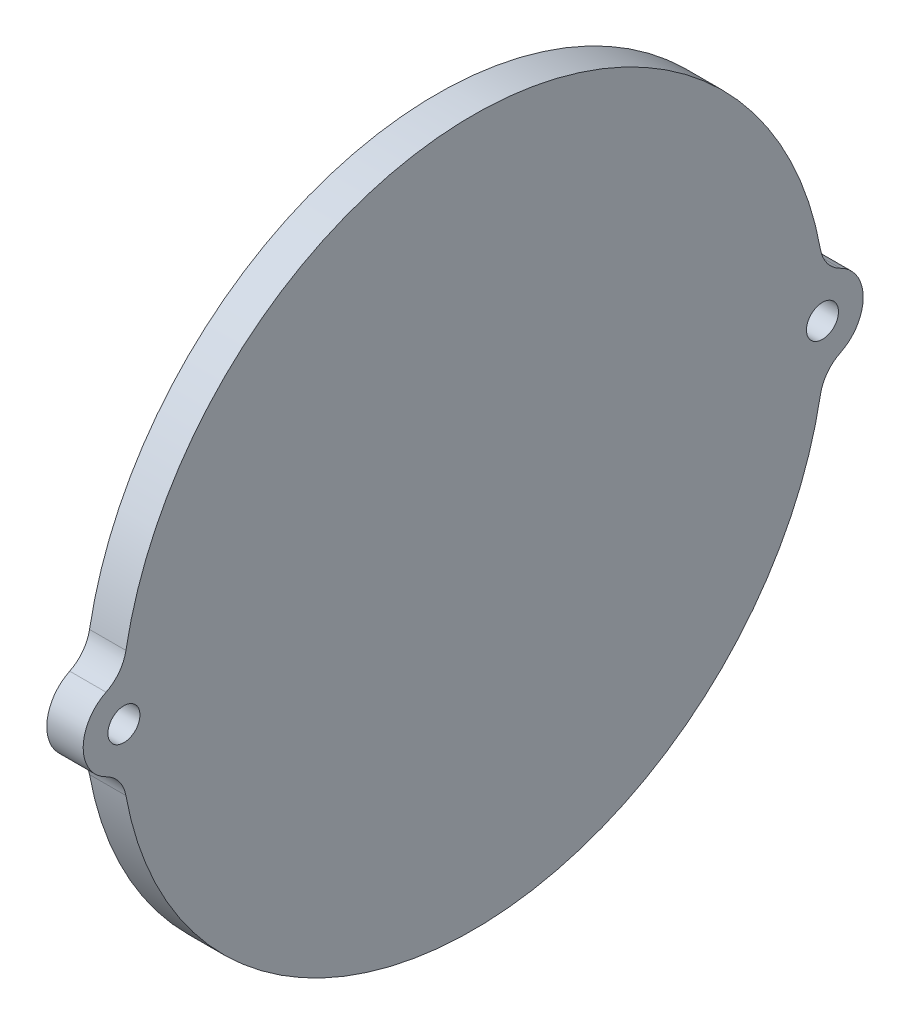
ISO-10303-21;
HEADER;
FILE_DESCRIPTION(('STEP AP214'),'2;1');
FILE_NAME('part.step','',(''),(''),'','','');
FILE_SCHEMA(('AUTOMOTIVE_DESIGN { 1 0 10303 214 1 1 1 1 }'));
ENDSEC;
DATA;
#1=APPLICATION_CONTEXT('core data for automotive mechanical design processes');
#2=APPLICATION_PROTOCOL_DEFINITION('international standard','automotive_design',2000,#1);
#3=PRODUCT_CONTEXT('',#1,'mechanical');
#4=PRODUCT('Part','Part','',(#3));
#5=PRODUCT_RELATED_PRODUCT_CATEGORY('part','',(#4));
#6=PRODUCT_DEFINITION_FORMATION('','',#4);
#7=PRODUCT_DEFINITION_CONTEXT('part definition',#1,'design');
#8=PRODUCT_DEFINITION('design','',#6,#7);
#9=PRODUCT_DEFINITION_SHAPE('','',#8);
#10=(LENGTH_UNIT() NAMED_UNIT(*) SI_UNIT(.MILLI.,.METRE.));
#11=(NAMED_UNIT(*) PLANE_ANGLE_UNIT() SI_UNIT($,.RADIAN.));
#12=(NAMED_UNIT(*) SI_UNIT($,.STERADIAN.) SOLID_ANGLE_UNIT());
#13=UNCERTAINTY_MEASURE_WITH_UNIT(LENGTH_MEASURE(1.E-05),#10,'distance_accuracy_value','');
#14=(GEOMETRIC_REPRESENTATION_CONTEXT(3) GLOBAL_UNCERTAINTY_ASSIGNED_CONTEXT((#13)) GLOBAL_UNIT_ASSIGNED_CONTEXT((#10,
#11,#12)) REPRESENTATION_CONTEXT('',''));
#15=CARTESIAN_POINT('',(0.,0.,0.));
#16=DIRECTION('',(0.,0.,1.));
#17=DIRECTION('',(1.,0.,0.));
#18=AXIS2_PLACEMENT_3D('',#15,#16,#17);
#19=CARTESIAN_POINT('',(0.,0.,0.));
#20=DIRECTION('',(1.,0.,0.));
#21=DIRECTION('',(0.,0.,-1.));
#22=AXIS2_PLACEMENT_3D('',#19,#20,#21);
#23=CYLINDRICAL_SURFACE('',#22,24.25);
#24=CARTESIAN_POINT('',(0.,0.,0.));
#25=DIRECTION('',(1.,0.,0.));
#26=DIRECTION('',(0.,0.,-1.));
#27=AXIS2_PLACEMENT_3D('',#24,#25,#26);
#28=CIRCLE('',#27,24.25);
#29=CARTESIAN_POINT('',(0.,4.3188637356535,-23.8623116238318));
#30=VERTEX_POINT('',#29);
#31=CARTESIAN_POINT('',(0.,4.3188637356535,23.8623116238318));
#32=VERTEX_POINT('',#31);
#33=EDGE_CURVE('E154',#30,#32,#28,.T.);
#34=ORIENTED_EDGE('',*,*,#33,.F.);
#35=DIRECTION('',(1.,0.,0.));
#36=VECTOR('',#35,1.);
#37=CARTESIAN_POINT('',(0.,4.3188637356535,-23.8623116238318));
#38=LINE('',#37,#36);
#39=CARTESIAN_POINT('',(-2.5,4.3188637356535,-23.8623116238318));
#40=VERTEX_POINT('',#39);
#41=EDGE_CURVE('E160',#30,#40,#38,.F.);
#42=ORIENTED_EDGE('',*,*,#41,.T.);
#43=CARTESIAN_POINT('',(-2.5,0.,0.));
#44=DIRECTION('',(1.,0.,0.));
#45=DIRECTION('',(0.,0.,-1.));
#46=AXIS2_PLACEMENT_3D('',#43,#44,#45);
#47=CIRCLE('',#46,24.25);
#48=CARTESIAN_POINT('',(-2.5,4.3188637356535,23.8623116238318));
#49=VERTEX_POINT('',#48);
#50=EDGE_CURVE('E149',#40,#49,#47,.T.);
#51=ORIENTED_EDGE('',*,*,#50,.T.);
#52=DIRECTION('',(1.,0.,0.));
#53=VECTOR('',#52,1.);
#54=CARTESIAN_POINT('',(0.,4.3188637356535,23.8623116238318));
#55=LINE('',#54,#53);
#56=EDGE_CURVE('E158',#49,#32,#55,.T.);
#57=ORIENTED_EDGE('',*,*,#56,.T.);
#58=EDGE_LOOP('',(#34,#42,#51,#57));
#59=FACE_BOUND('',#58,.T.);
#60=ADVANCED_FACE('F34',(#59),#23,.T.);
#61=CARTESIAN_POINT('',(-2.5,0.,0.));
#62=DIRECTION('',(-1.,0.,0.));
#63=DIRECTION('',(0.,0.,1.));
#64=AXIS2_PLACEMENT_3D('',#61,#62,#63);
#65=PLANE('',#64);
#66=CARTESIAN_POINT('',(-2.5,0.,24.));
#67=DIRECTION('',(-1.,0.,0.));
#68=DIRECTION('',(0.,0.,1.));
#69=AXIS2_PLACEMENT_3D('',#66,#67,#68);
#70=CIRCLE('',#69,1.1);
#71=CARTESIAN_POINT('',(-2.5,0.,25.1));
#72=VERTEX_POINT('',#71);
#73=EDGE_CURVE('E142',#72,#72,#70,.F.);
#74=ORIENTED_EDGE('',*,*,#73,.T.);
#75=EDGE_LOOP('',(#74));
#76=FACE_BOUND('',#75,.T.);
#77=CARTESIAN_POINT('',(-2.5,0.,-24.));
#78=DIRECTION('',(-1.,0.,0.));
#79=DIRECTION('',(0.,0.,1.));
#80=AXIS2_PLACEMENT_3D('',#77,#78,#79);
#81=CIRCLE('',#80,1.1);
#82=CARTESIAN_POINT('',(-2.5,0.,-22.9));
#83=VERTEX_POINT('',#82);
#84=EDGE_CURVE('E139',#83,#83,#81,.F.);
#85=ORIENTED_EDGE('',*,*,#84,.T.);
#86=EDGE_LOOP('',(#85));
#87=FACE_BOUND('',#86,.T.);
#88=CARTESIAN_POINT('',(-2.5,0.,0.));
#89=DIRECTION('',(-1.,0.,0.));
#90=DIRECTION('',(0.,0.,1.));
#91=AXIS2_PLACEMENT_3D('',#88,#89,#90);
#92=CIRCLE('',#91,17.25);
#93=CARTESIAN_POINT('',(-2.5,0.,17.25));
#94=VERTEX_POINT('',#93);
#95=EDGE_CURVE('E135',#94,#94,#92,.T.);
#96=ORIENTED_EDGE('',*,*,#95,.F.);
#97=EDGE_LOOP('',(#96));
#98=FACE_BOUND('',#97,.T.);
#99=ORIENTED_EDGE('',*,*,#50,.F.);
#100=CARTESIAN_POINT('',(-2.5,4.76410741974149,-26.32234375));
#101=DIRECTION('',(-1.,0.,0.));
#102=DIRECTION('',(0.,0.,1.));
#103=AXIS2_PLACEMENT_3D('',#100,#101,#102);
#104=CIRCLE('',#103,2.5);
#105=CARTESIAN_POINT('',(-2.5,2.51688693873135,-25.2268985849057));
#106=VERTEX_POINT('',#105);
#107=EDGE_CURVE('E112',#40,#106,#104,.F.);
#108=ORIENTED_EDGE('',*,*,#107,.T.);
#109=CARTESIAN_POINT('',(-2.5,0.,-24.));
#110=DIRECTION('',(-1.,0.,0.));
#111=DIRECTION('',(0.,0.,1.));
#112=AXIS2_PLACEMENT_3D('',#109,#110,#111);
#113=CIRCLE('',#112,2.8);
#114=CARTESIAN_POINT('',(-2.5,-2.51688693873135,-25.2268985849057));
#115=VERTEX_POINT('',#114);
#116=EDGE_CURVE('E119',#115,#106,#113,.F.);
#117=ORIENTED_EDGE('',*,*,#116,.F.);
#118=CARTESIAN_POINT('',(-2.5,-4.76410741974149,-26.32234375));
#119=DIRECTION('',(-1.,0.,0.));
#120=DIRECTION('',(0.,0.,1.));
#121=AXIS2_PLACEMENT_3D('',#118,#119,#120);
#122=CIRCLE('',#121,2.5);
#123=CARTESIAN_POINT('',(-2.5,-4.3188637356535,-23.8623116238318));
#124=VERTEX_POINT('',#123);
#125=EDGE_CURVE('E101',#115,#124,#122,.F.);
#126=ORIENTED_EDGE('',*,*,#125,.T.);
#127=CARTESIAN_POINT('',(-2.5,-4.3188637356535,23.8623116238318));
#128=VERTEX_POINT('',#127);
#129=EDGE_CURVE('E152',#128,#124,#47,.T.);
#130=ORIENTED_EDGE('',*,*,#129,.F.);
#131=CARTESIAN_POINT('',(-2.5,-4.76410741974149,26.32234375));
#132=DIRECTION('',(-1.,0.,0.));
#133=DIRECTION('',(0.,0.,1.));
#134=AXIS2_PLACEMENT_3D('',#131,#132,#133);
#135=CIRCLE('',#134,2.5);
#136=CARTESIAN_POINT('',(-2.5,-2.51688693873135,25.2268985849057));
#137=VERTEX_POINT('',#136);
#138=EDGE_CURVE('E175',#128,#137,#135,.F.);
#139=ORIENTED_EDGE('',*,*,#138,.T.);
#140=CARTESIAN_POINT('',(-2.5,0.,24.));
#141=DIRECTION('',(-1.,0.,0.));
#142=DIRECTION('',(0.,0.,1.));
#143=AXIS2_PLACEMENT_3D('',#140,#141,#142);
#144=CIRCLE('',#143,2.8);
#145=CARTESIAN_POINT('',(-2.5,2.51688693873135,25.2268985849057));
#146=VERTEX_POINT('',#145);
#147=EDGE_CURVE('E146',#146,#137,#144,.F.);
#148=ORIENTED_EDGE('',*,*,#147,.F.);
#149=CARTESIAN_POINT('',(-2.5,4.76410741974149,26.32234375));
#150=DIRECTION('',(-1.,0.,0.));
#151=DIRECTION('',(0.,0.,1.));
#152=AXIS2_PLACEMENT_3D('',#149,#150,#151);
#153=CIRCLE('',#152,2.5);
#154=EDGE_CURVE('E177',#146,#49,#153,.F.);
#155=ORIENTED_EDGE('',*,*,#154,.T.);
#156=EDGE_LOOP('',(#99,#108,#117,#126,#130,#139,#148,#155));
#157=FACE_BOUND('',#156,.T.);
#158=ADVANCED_FACE('F127',(#76,#87,#98,#157),#65,.T.);
#159=CARTESIAN_POINT('',(0.,0.,0.));
#160=DIRECTION('',(1.,0.,0.));
#161=DIRECTION('',(0.,0.,-1.));
#162=AXIS2_PLACEMENT_3D('',#159,#160,#161);
#163=PLANE('',#162);
#164=CARTESIAN_POINT('',(0.,0.,24.));
#165=DIRECTION('',(1.,0.,0.));
#166=DIRECTION('',(0.,0.,-1.));
#167=AXIS2_PLACEMENT_3D('',#164,#165,#166);
#168=CIRCLE('',#167,1.1);
#169=CARTESIAN_POINT('',(0.,0.,22.9));
#170=VERTEX_POINT('',#169);
#171=EDGE_CURVE('E143',#170,#170,#168,.T.);
#172=ORIENTED_EDGE('',*,*,#171,.F.);
#173=EDGE_LOOP('',(#172));
#174=FACE_BOUND('',#173,.T.);
#175=CARTESIAN_POINT('',(0.,0.,-24.));
#176=DIRECTION('',(1.,0.,0.));
#177=DIRECTION('',(0.,0.,1.));
#178=AXIS2_PLACEMENT_3D('',#175,#176,#177);
#179=CIRCLE('',#178,1.1);
#180=CARTESIAN_POINT('',(0.,0.,-22.9));
#181=VERTEX_POINT('',#180);
#182=EDGE_CURVE('E129',#181,#181,#179,.T.);
#183=ORIENTED_EDGE('',*,*,#182,.F.);
#184=EDGE_LOOP('',(#183));
#185=FACE_BOUND('',#184,.T.);
#186=CARTESIAN_POINT('',(0.,0.,24.));
#187=DIRECTION('',(1.,0.,0.));
#188=DIRECTION('',(0.,0.,-1.));
#189=AXIS2_PLACEMENT_3D('',#186,#187,#188);
#190=CIRCLE('',#189,2.8);
#191=CARTESIAN_POINT('',(0.,2.51688693873135,25.2268985849057));
#192=VERTEX_POINT('',#191);
#193=CARTESIAN_POINT('',(0.,-2.51688693873135,25.2268985849057));
#194=VERTEX_POINT('',#193);
#195=EDGE_CURVE('E140',#192,#194,#190,.T.);
#196=ORIENTED_EDGE('',*,*,#195,.T.);
#197=CARTESIAN_POINT('',(0.,-4.76410741974149,26.32234375));
#198=DIRECTION('',(1.,0.,0.));
#199=DIRECTION('',(0.,0.,-1.));
#200=AXIS2_PLACEMENT_3D('',#197,#198,#199);
#201=CIRCLE('',#200,2.5);
#202=CARTESIAN_POINT('',(0.,-4.3188637356535,23.8623116238318));
#203=VERTEX_POINT('',#202);
#204=EDGE_CURVE('E49',#194,#203,#201,.F.);
#205=ORIENTED_EDGE('',*,*,#204,.T.);
#206=CARTESIAN_POINT('',(0.,-4.3188637356535,-23.8623116238318));
#207=VERTEX_POINT('',#206);
#208=EDGE_CURVE('E124',#203,#207,#28,.T.);
#209=ORIENTED_EDGE('',*,*,#208,.T.);
#210=CARTESIAN_POINT('',(0.,-4.76410741974149,-26.32234375));
#211=DIRECTION('',(1.,0.,0.));
#212=DIRECTION('',(0.,0.,-1.));
#213=AXIS2_PLACEMENT_3D('',#210,#211,#212);
#214=CIRCLE('',#213,2.5);
#215=CARTESIAN_POINT('',(0.,-2.51688693873135,-25.2268985849057));
#216=VERTEX_POINT('',#215);
#217=EDGE_CURVE('E111',#207,#216,#214,.F.);
#218=ORIENTED_EDGE('',*,*,#217,.T.);
#219=CARTESIAN_POINT('',(0.,0.,-24.));
#220=DIRECTION('',(1.,0.,0.));
#221=DIRECTION('',(0.,0.,-1.));
#222=AXIS2_PLACEMENT_3D('',#219,#220,#221);
#223=CIRCLE('',#222,2.8);
#224=CARTESIAN_POINT('',(0.,2.51688693873135,-25.2268985849057));
#225=VERTEX_POINT('',#224);
#226=EDGE_CURVE('E122',#216,#225,#223,.T.);
#227=ORIENTED_EDGE('',*,*,#226,.T.);
#228=CARTESIAN_POINT('',(0.,4.76410741974149,-26.32234375));
#229=DIRECTION('',(1.,0.,0.));
#230=DIRECTION('',(0.,0.,-1.));
#231=AXIS2_PLACEMENT_3D('',#228,#229,#230);
#232=CIRCLE('',#231,2.5);
#233=EDGE_CURVE('E170',#225,#30,#232,.F.);
#234=ORIENTED_EDGE('',*,*,#233,.T.);
#235=ORIENTED_EDGE('',*,*,#33,.T.);
#236=CARTESIAN_POINT('',(0.,4.76410741974149,26.32234375));
#237=DIRECTION('',(1.,0.,0.));
#238=DIRECTION('',(0.,0.,-1.));
#239=AXIS2_PLACEMENT_3D('',#236,#237,#238);
#240=CIRCLE('',#239,2.5);
#241=EDGE_CURVE('E42',#32,#192,#240,.F.);
#242=ORIENTED_EDGE('',*,*,#241,.T.);
#243=EDGE_LOOP('',(#196,#205,#209,#218,#227,#234,#235,#242));
#244=FACE_BOUND('',#243,.T.);
#245=ADVANCED_FACE('F188',(#174,#185,#244),#163,.T.);
#246=ORIENTED_EDGE('',*,*,#129,.T.);
#247=DIRECTION('',(1.,0.,0.));
#248=VECTOR('',#247,1.);
#249=CARTESIAN_POINT('',(0.,-4.3188637356535,-23.8623116238318));
#250=LINE('',#249,#248);
#251=EDGE_CURVE('E106',#124,#207,#250,.T.);
#252=ORIENTED_EDGE('',*,*,#251,.T.);
#253=ORIENTED_EDGE('',*,*,#208,.F.);
#254=DIRECTION('',(1.,0.,0.));
#255=VECTOR('',#254,1.);
#256=CARTESIAN_POINT('',(0.,-4.3188637356535,23.8623116238318));
#257=LINE('',#256,#255);
#258=EDGE_CURVE('E162',#203,#128,#257,.F.);
#259=ORIENTED_EDGE('',*,*,#258,.T.);
#260=EDGE_LOOP('',(#246,#252,#253,#259));
#261=FACE_BOUND('',#260,.T.);
#262=ADVANCED_FACE('F191',(#261),#23,.T.);
#263=CARTESIAN_POINT('',(-10.4195959492893,0.,24.));
#264=DIRECTION('',(1.,0.,0.));
#265=DIRECTION('',(0.,0.,-1.));
#266=AXIS2_PLACEMENT_3D('',#263,#264,#265);
#267=CYLINDRICAL_SURFACE('',#266,2.8);
#268=ORIENTED_EDGE('',*,*,#147,.T.);
#269=DIRECTION('',(1.,0.,0.));
#270=VECTOR('',#269,1.);
#271=CARTESIAN_POINT('',(-10.4195959492893,-2.51688693873135,25.2268985849057));
#272=LINE('',#271,#270);
#273=EDGE_CURVE('E168',#137,#194,#272,.T.);
#274=ORIENTED_EDGE('',*,*,#273,.T.);
#275=ORIENTED_EDGE('',*,*,#195,.F.);
#276=DIRECTION('',(1.,0.,0.));
#277=VECTOR('',#276,1.);
#278=CARTESIAN_POINT('',(-10.4195959492893,2.51688693873135,25.2268985849057));
#279=LINE('',#278,#277);
#280=EDGE_CURVE('E165',#192,#146,#279,.F.);
#281=ORIENTED_EDGE('',*,*,#280,.T.);
#282=EDGE_LOOP('',(#268,#274,#275,#281));
#283=FACE_BOUND('',#282,.T.);
#284=ADVANCED_FACE('F187',(#283),#267,.T.);
#285=CARTESIAN_POINT('',(-10.4195959492893,0.,24.));
#286=DIRECTION('',(1.,0.,0.));
#287=DIRECTION('',(0.,0.,-1.));
#288=AXIS2_PLACEMENT_3D('',#285,#286,#287);
#289=CYLINDRICAL_SURFACE('',#288,1.1);
#290=ORIENTED_EDGE('',*,*,#171,.T.);
#291=EDGE_LOOP('',(#290));
#292=FACE_BOUND('',#291,.T.);
#293=ORIENTED_EDGE('',*,*,#73,.F.);
#294=EDGE_LOOP('',(#293));
#295=FACE_BOUND('',#294,.T.);
#296=ADVANCED_FACE('F217',(#292,#295),#289,.F.);
#297=CARTESIAN_POINT('',(-10.4195959492893,0.,-24.));
#298=DIRECTION('',(1.,0.,0.));
#299=DIRECTION('',(0.,0.,-1.));
#300=AXIS2_PLACEMENT_3D('',#297,#298,#299);
#301=CYLINDRICAL_SURFACE('',#300,2.8);
#302=ORIENTED_EDGE('',*,*,#116,.T.);
#303=DIRECTION('',(1.,0.,0.));
#304=VECTOR('',#303,1.);
#305=CARTESIAN_POINT('',(-10.4195959492893,2.51688693873135,-25.2268985849057));
#306=LINE('',#305,#304);
#307=EDGE_CURVE('E123',#106,#225,#306,.T.);
#308=ORIENTED_EDGE('',*,*,#307,.T.);
#309=ORIENTED_EDGE('',*,*,#226,.F.);
#310=DIRECTION('',(1.,0.,0.));
#311=VECTOR('',#310,1.);
#312=CARTESIAN_POINT('',(-10.4195959492893,-2.51688693873135,-25.2268985849057));
#313=LINE('',#312,#311);
#314=EDGE_CURVE('E105',#216,#115,#313,.F.);
#315=ORIENTED_EDGE('',*,*,#314,.T.);
#316=EDGE_LOOP('',(#302,#308,#309,#315));
#317=FACE_BOUND('',#316,.T.);
#318=ADVANCED_FACE('F117',(#317),#301,.T.);
#319=CARTESIAN_POINT('',(-10.4195959492893,0.,-24.));
#320=DIRECTION('',(1.,0.,0.));
#321=DIRECTION('',(0.,0.,-1.));
#322=AXIS2_PLACEMENT_3D('',#319,#320,#321);
#323=CYLINDRICAL_SURFACE('',#322,1.1);
#324=ORIENTED_EDGE('',*,*,#182,.T.);
#325=EDGE_LOOP('',(#324));
#326=FACE_BOUND('',#325,.T.);
#327=ORIENTED_EDGE('',*,*,#84,.F.);
#328=EDGE_LOOP('',(#327));
#329=FACE_BOUND('',#328,.T.);
#330=ADVANCED_FACE('F226',(#326,#329),#323,.F.);
#331=CARTESIAN_POINT('',(0.,4.76410741974149,-26.32234375));
#332=DIRECTION('',(-1.,0.,0.));
#333=DIRECTION('',(0.,0.,1.));
#334=AXIS2_PLACEMENT_3D('',#331,#332,#333);
#335=CYLINDRICAL_SURFACE('',#334,2.5);
#336=ORIENTED_EDGE('',*,*,#107,.F.);
#337=ORIENTED_EDGE('',*,*,#41,.F.);
#338=ORIENTED_EDGE('',*,*,#233,.F.);
#339=ORIENTED_EDGE('',*,*,#307,.F.);
#340=EDGE_LOOP('',(#336,#337,#338,#339));
#341=FACE_BOUND('',#340,.T.);
#342=ADVANCED_FACE('F200',(#341),#335,.F.);
#343=CARTESIAN_POINT('',(0.,-4.76410741974149,-26.32234375));
#344=DIRECTION('',(1.,0.,0.));
#345=DIRECTION('',(0.,0.,-1.));
#346=AXIS2_PLACEMENT_3D('',#343,#344,#345);
#347=CYLINDRICAL_SURFACE('',#346,2.5);
#348=ORIENTED_EDGE('',*,*,#217,.F.);
#349=ORIENTED_EDGE('',*,*,#251,.F.);
#350=ORIENTED_EDGE('',*,*,#125,.F.);
#351=ORIENTED_EDGE('',*,*,#314,.F.);
#352=EDGE_LOOP('',(#348,#349,#350,#351));
#353=FACE_BOUND('',#352,.T.);
#354=ADVANCED_FACE('F104',(#353),#347,.F.);
#355=CARTESIAN_POINT('',(0.,-4.76410741974149,26.32234375));
#356=DIRECTION('',(-1.,0.,0.));
#357=DIRECTION('',(0.,0.,1.));
#358=AXIS2_PLACEMENT_3D('',#355,#356,#357);
#359=CYLINDRICAL_SURFACE('',#358,2.5);
#360=ORIENTED_EDGE('',*,*,#138,.F.);
#361=ORIENTED_EDGE('',*,*,#258,.F.);
#362=ORIENTED_EDGE('',*,*,#204,.F.);
#363=ORIENTED_EDGE('',*,*,#273,.F.);
#364=EDGE_LOOP('',(#360,#361,#362,#363));
#365=FACE_BOUND('',#364,.T.);
#366=ADVANCED_FACE('F193',(#365),#359,.F.);
#367=CARTESIAN_POINT('',(0.,4.76410741974149,26.32234375));
#368=DIRECTION('',(1.,0.,0.));
#369=DIRECTION('',(0.,0.,-1.));
#370=AXIS2_PLACEMENT_3D('',#367,#368,#369);
#371=CYLINDRICAL_SURFACE('',#370,2.5);
#372=ORIENTED_EDGE('',*,*,#241,.F.);
#373=ORIENTED_EDGE('',*,*,#56,.F.);
#374=ORIENTED_EDGE('',*,*,#154,.F.);
#375=ORIENTED_EDGE('',*,*,#280,.F.);
#376=EDGE_LOOP('',(#372,#373,#374,#375));
#377=FACE_BOUND('',#376,.T.);
#378=ADVANCED_FACE('F36',(#377),#371,.F.);
#379=CARTESIAN_POINT('',(-3.,0.,0.));
#380=DIRECTION('',(-1.,0.,0.));
#381=DIRECTION('',(0.,0.,1.));
#382=AXIS2_PLACEMENT_3D('',#379,#380,#381);
#383=PLANE('',#382);
#384=CARTESIAN_POINT('',(-3.,0.,0.));
#385=DIRECTION('',(-1.,0.,0.));
#386=DIRECTION('',(0.,0.,1.));
#387=AXIS2_PLACEMENT_3D('',#384,#385,#386);
#388=CIRCLE('',#387,17.25);
#389=CARTESIAN_POINT('',(-3.,0.,17.25));
#390=VERTEX_POINT('',#389);
#391=EDGE_CURVE('E130',#390,#390,#388,.T.);
#392=ORIENTED_EDGE('',*,*,#391,.T.);
#393=EDGE_LOOP('',(#392));
#394=FACE_BOUND('',#393,.T.);
#395=CARTESIAN_POINT('',(-3.,0.,0.));
#396=DIRECTION('',(-1.,0.,0.));
#397=DIRECTION('',(0.,0.,1.));
#398=AXIS2_PLACEMENT_3D('',#395,#396,#397);
#399=CIRCLE('',#398,9.75);
#400=CARTESIAN_POINT('',(-3.,0.,9.75));
#401=VERTEX_POINT('',#400);
#402=EDGE_CURVE('E237',#401,#401,#399,.T.);
#403=ORIENTED_EDGE('',*,*,#402,.F.);
#404=EDGE_LOOP('',(#403));
#405=FACE_BOUND('',#404,.T.);
#406=ADVANCED_FACE('F199',(#394,#405),#383,.T.);
#407=CARTESIAN_POINT('',(-3.,0.,0.));
#408=DIRECTION('',(1.,0.,0.));
#409=DIRECTION('',(0.,0.,-1.));
#410=AXIS2_PLACEMENT_3D('',#407,#408,#409);
#411=CYLINDRICAL_SURFACE('',#410,17.25);
#412=ORIENTED_EDGE('',*,*,#391,.F.);
#413=EDGE_LOOP('',(#412));
#414=FACE_BOUND('',#413,.T.);
#415=ORIENTED_EDGE('',*,*,#95,.T.);
#416=EDGE_LOOP('',(#415));
#417=FACE_BOUND('',#416,.T.);
#418=ADVANCED_FACE('F246',(#414,#417),#411,.T.);
#419=CARTESIAN_POINT('',(-3.,0.,0.));
#420=DIRECTION('',(1.,0.,0.));
#421=DIRECTION('',(0.,0.,-1.));
#422=AXIS2_PLACEMENT_3D('',#419,#420,#421);
#423=CYLINDRICAL_SURFACE('',#422,9.75);
#424=ORIENTED_EDGE('',*,*,#402,.T.);
#425=EDGE_LOOP('',(#424));
#426=FACE_BOUND('',#425,.T.);
#427=CARTESIAN_POINT('',(-2.5,0.,0.));
#428=DIRECTION('',(-1.,0.,0.));
#429=DIRECTION('',(0.,0.,1.));
#430=AXIS2_PLACEMENT_3D('',#427,#428,#429);
#431=CIRCLE('',#430,9.75);
#432=CARTESIAN_POINT('',(-2.5,0.,9.75));
#433=VERTEX_POINT('',#432);
#434=EDGE_CURVE('E11',#433,#433,#431,.F.);
#435=ORIENTED_EDGE('',*,*,#434,.T.);
#436=EDGE_LOOP('',(#435));
#437=FACE_BOUND('',#436,.T.);
#438=ADVANCED_FACE('F242',(#426,#437),#423,.F.);
#439=ORIENTED_EDGE('',*,*,#434,.F.);
#440=EDGE_LOOP('',(#439));
#441=FACE_BOUND('',#440,.T.);
#442=ADVANCED_FACE('F209',(#441),#65,.T.);
#443=CLOSED_SHELL('',(#60,#158,#245,#262,#284,#296,#318,#330,#342,#354,#366,#378,#406,#418,#438,#442));
#444=MANIFOLD_SOLID_BREP('B2',#443);
#445=ADVANCED_BREP_SHAPE_REPRESENTATION('',(#18,#444),#14);
#446=SHAPE_DEFINITION_REPRESENTATION(#9,#445);
ENDSEC;
END-ISO-10303-21;
